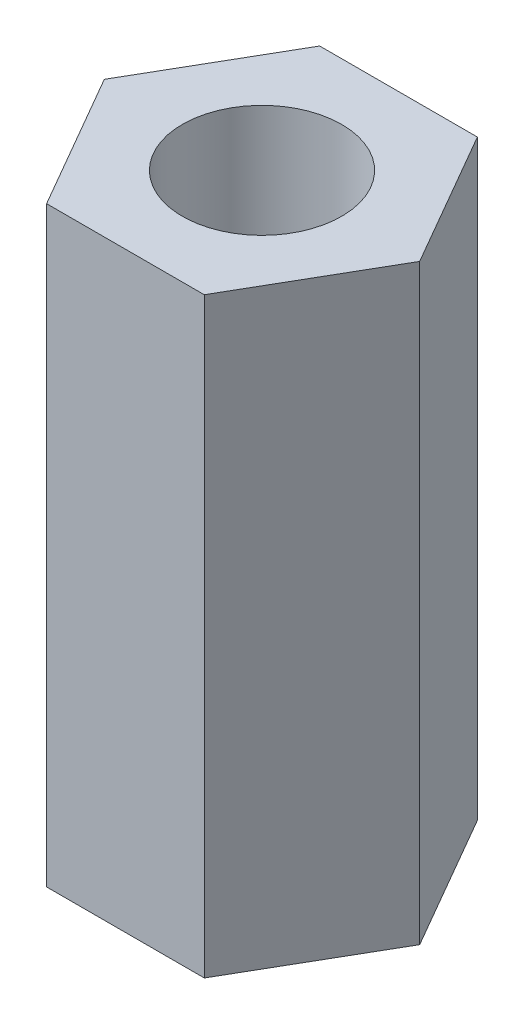
ISO-10303-21;
HEADER;
FILE_DESCRIPTION(('STEP AP214'),'2;1');
FILE_NAME('part.step','',(''),(''),'','','');
FILE_SCHEMA(('AUTOMOTIVE_DESIGN { 1 0 10303 214 1 1 1 1 }'));
ENDSEC;
DATA;
#1=APPLICATION_CONTEXT('core data for automotive mechanical design processes');
#2=APPLICATION_PROTOCOL_DEFINITION('international standard','automotive_design',2000,#1);
#3=PRODUCT_CONTEXT('',#1,'mechanical');
#4=PRODUCT('Part','Part','',(#3));
#5=PRODUCT_RELATED_PRODUCT_CATEGORY('part','',(#4));
#6=PRODUCT_DEFINITION_FORMATION('','',#4);
#7=PRODUCT_DEFINITION_CONTEXT('part definition',#1,'design');
#8=PRODUCT_DEFINITION('design','',#6,#7);
#9=PRODUCT_DEFINITION_SHAPE('','',#8);
#10=(LENGTH_UNIT() NAMED_UNIT(*) SI_UNIT(.MILLI.,.METRE.));
#11=(NAMED_UNIT(*) PLANE_ANGLE_UNIT() SI_UNIT($,.RADIAN.));
#12=(NAMED_UNIT(*) SI_UNIT($,.STERADIAN.) SOLID_ANGLE_UNIT());
#13=UNCERTAINTY_MEASURE_WITH_UNIT(LENGTH_MEASURE(1.E-05),#10,'distance_accuracy_value','');
#14=(GEOMETRIC_REPRESENTATION_CONTEXT(3) GLOBAL_UNCERTAINTY_ASSIGNED_CONTEXT((#13)) GLOBAL_UNIT_ASSIGNED_CONTEXT((#10,
#11,#12)) REPRESENTATION_CONTEXT('',''));
#15=CARTESIAN_POINT('',(0.,0.,0.));
#16=DIRECTION('',(0.,0.,1.));
#17=DIRECTION('',(1.,0.,0.));
#18=AXIS2_PLACEMENT_3D('',#15,#16,#17);
#19=CARTESIAN_POINT('',(0.,13.,0.));
#20=DIRECTION('',(0.,1.,0.));
#21=DIRECTION('',(0.,0.,1.));
#22=AXIS2_PLACEMENT_3D('',#19,#20,#21);
#23=PLANE('',#22);
#24=DIRECTION('',(0.5,0.,-0.866025403784439));
#25=VECTOR('',#24,1.);
#26=CARTESIAN_POINT('',(1.73205080756888,13.,3.));
#27=LINE('',#26,#25);
#28=CARTESIAN_POINT('',(1.73205080756888,13.,3.));
#29=VERTEX_POINT('',#28);
#30=CARTESIAN_POINT('',(3.46410161513775,13.,0.));
#31=VERTEX_POINT('',#30);
#32=EDGE_CURVE('E135',#29,#31,#27,.T.);
#33=ORIENTED_EDGE('',*,*,#32,.T.);
#34=DIRECTION('',(-0.5,0.,-0.866025403784438));
#35=VECTOR('',#34,1.);
#36=CARTESIAN_POINT('',(3.46410161513775,13.,0.));
#37=LINE('',#36,#35);
#38=CARTESIAN_POINT('',(1.73205080756887,13.,-3.));
#39=VERTEX_POINT('',#38);
#40=EDGE_CURVE('E93',#31,#39,#37,.T.);
#41=ORIENTED_EDGE('',*,*,#40,.T.);
#42=DIRECTION('',(-1.,0.,0.));
#43=VECTOR('',#42,1.);
#44=CARTESIAN_POINT('',(1.73205080756887,13.,-3.));
#45=LINE('',#44,#43);
#46=CARTESIAN_POINT('',(-1.73205080756888,13.,-3.));
#47=VERTEX_POINT('',#46);
#48=EDGE_CURVE('E106',#39,#47,#45,.T.);
#49=ORIENTED_EDGE('',*,*,#48,.T.);
#50=DIRECTION('',(-0.5,0.,0.866025403784439));
#51=VECTOR('',#50,1.);
#52=CARTESIAN_POINT('',(-1.73205080756888,13.,-3.));
#53=LINE('',#52,#51);
#54=CARTESIAN_POINT('',(-3.46410161513776,13.,0.));
#55=VERTEX_POINT('',#54);
#56=EDGE_CURVE('E100',#47,#55,#53,.T.);
#57=ORIENTED_EDGE('',*,*,#56,.T.);
#58=DIRECTION('',(0.5,0.,0.866025403784439));
#59=VECTOR('',#58,1.);
#60=CARTESIAN_POINT('',(-3.46410161513776,13.,0.));
#61=LINE('',#60,#59);
#62=CARTESIAN_POINT('',(-1.73205080756888,13.,3.));
#63=VERTEX_POINT('',#62);
#64=EDGE_CURVE('E104',#55,#63,#61,.T.);
#65=ORIENTED_EDGE('',*,*,#64,.T.);
#66=DIRECTION('',(1.,0.,0.));
#67=VECTOR('',#66,1.);
#68=CARTESIAN_POINT('',(-1.73205080756888,13.,3.));
#69=LINE('',#68,#67);
#70=EDGE_CURVE('E56',#63,#29,#69,.T.);
#71=ORIENTED_EDGE('',*,*,#70,.T.);
#72=EDGE_LOOP('',(#33,#41,#49,#57,#65,#71));
#73=FACE_BOUND('',#72,.T.);
#74=CARTESIAN_POINT('',(0.,13.,0.));
#75=DIRECTION('',(0.,1.,0.));
#76=DIRECTION('',(0.,0.,1.));
#77=AXIS2_PLACEMENT_3D('',#74,#75,#76);
#78=CIRCLE('',#77,1.75);
#79=CARTESIAN_POINT('',(0.,13.,-1.75));
#80=VERTEX_POINT('',#79);
#81=EDGE_CURVE('E128',#80,#80,#78,.T.);
#82=ORIENTED_EDGE('',*,*,#81,.F.);
#83=EDGE_LOOP('',(#82));
#84=FACE_BOUND('',#83,.T.);
#85=ADVANCED_FACE('F39',(#73,#84),#23,.T.);
#86=CARTESIAN_POINT('',(0.,0.,0.));
#87=DIRECTION('',(0.,1.,0.));
#88=DIRECTION('',(0.,0.,1.));
#89=AXIS2_PLACEMENT_3D('',#86,#87,#88);
#90=PLANE('',#89);
#91=DIRECTION('',(0.5,0.,-0.866025403784439));
#92=VECTOR('',#91,1.);
#93=CARTESIAN_POINT('',(1.73205080756888,0.,3.));
#94=LINE('',#93,#92);
#95=CARTESIAN_POINT('',(1.73205080756888,0.,3.));
#96=VERTEX_POINT('',#95);
#97=CARTESIAN_POINT('',(3.46410161513775,0.,0.));
#98=VERTEX_POINT('',#97);
#99=EDGE_CURVE('E124',#96,#98,#94,.T.);
#100=ORIENTED_EDGE('',*,*,#99,.F.);
#101=DIRECTION('',(1.,0.,0.));
#102=VECTOR('',#101,1.);
#103=CARTESIAN_POINT('',(-1.73205080756888,0.,3.));
#104=LINE('',#103,#102);
#105=CARTESIAN_POINT('',(-1.73205080756888,0.,3.));
#106=VERTEX_POINT('',#105);
#107=EDGE_CURVE('E85',#106,#96,#104,.T.);
#108=ORIENTED_EDGE('',*,*,#107,.F.);
#109=DIRECTION('',(0.5,0.,0.866025403784439));
#110=VECTOR('',#109,1.);
#111=CARTESIAN_POINT('',(-3.46410161513776,0.,0.));
#112=LINE('',#111,#110);
#113=CARTESIAN_POINT('',(-3.46410161513776,0.,0.));
#114=VERTEX_POINT('',#113);
#115=EDGE_CURVE('E79',#114,#106,#112,.T.);
#116=ORIENTED_EDGE('',*,*,#115,.F.);
#117=DIRECTION('',(-0.5,0.,0.866025403784439));
#118=VECTOR('',#117,1.);
#119=CARTESIAN_POINT('',(-1.73205080756888,0.,-3.));
#120=LINE('',#119,#118);
#121=CARTESIAN_POINT('',(-1.73205080756888,0.,-3.));
#122=VERTEX_POINT('',#121);
#123=EDGE_CURVE('E114',#122,#114,#120,.T.);
#124=ORIENTED_EDGE('',*,*,#123,.F.);
#125=DIRECTION('',(-1.,0.,0.));
#126=VECTOR('',#125,1.);
#127=CARTESIAN_POINT('',(1.73205080756887,0.,-3.));
#128=LINE('',#127,#126);
#129=CARTESIAN_POINT('',(1.73205080756887,0.,-3.));
#130=VERTEX_POINT('',#129);
#131=EDGE_CURVE('E130',#130,#122,#128,.T.);
#132=ORIENTED_EDGE('',*,*,#131,.F.);
#133=DIRECTION('',(-0.5,0.,-0.866025403784438));
#134=VECTOR('',#133,1.);
#135=CARTESIAN_POINT('',(3.46410161513775,0.,0.));
#136=LINE('',#135,#134);
#137=EDGE_CURVE('E127',#98,#130,#136,.T.);
#138=ORIENTED_EDGE('',*,*,#137,.F.);
#139=EDGE_LOOP('',(#100,#108,#116,#124,#132,#138));
#140=FACE_BOUND('',#139,.T.);
#141=CARTESIAN_POINT('',(0.,0.,0.));
#142=DIRECTION('',(0.,1.,0.));
#143=DIRECTION('',(0.,0.,1.));
#144=AXIS2_PLACEMENT_3D('',#141,#142,#143);
#145=CIRCLE('',#144,1.75);
#146=CARTESIAN_POINT('',(0.,0.,-1.75));
#147=VERTEX_POINT('',#146);
#148=EDGE_CURVE('E228',#147,#147,#145,.T.);
#149=ORIENTED_EDGE('',*,*,#148,.T.);
#150=EDGE_LOOP('',(#149));
#151=FACE_BOUND('',#150,.T.);
#152=ADVANCED_FACE('F144',(#140,#151),#90,.F.);
#153=CARTESIAN_POINT('',(1.73205080756888,13.,3.));
#154=DIRECTION('',(-0.866025403784439,0.,-0.5));
#155=DIRECTION('',(-0.5,0.,0.866025403784439));
#156=AXIS2_PLACEMENT_3D('',#153,#154,#155);
#157=PLANE('',#156);
#158=ORIENTED_EDGE('',*,*,#99,.T.);
#159=DIRECTION('',(0.,-1.,0.));
#160=VECTOR('',#159,1.);
#161=CARTESIAN_POINT('',(3.46410161513775,13.,0.));
#162=LINE('',#161,#160);
#163=EDGE_CURVE('E11',#31,#98,#162,.T.);
#164=ORIENTED_EDGE('',*,*,#163,.F.);
#165=ORIENTED_EDGE('',*,*,#32,.F.);
#166=DIRECTION('',(0.,-1.,0.));
#167=VECTOR('',#166,1.);
#168=CARTESIAN_POINT('',(1.73205080756888,13.,3.));
#169=LINE('',#168,#167);
#170=EDGE_CURVE('E120',#29,#96,#169,.T.);
#171=ORIENTED_EDGE('',*,*,#170,.T.);
#172=EDGE_LOOP('',(#158,#164,#165,#171));
#173=FACE_BOUND('',#172,.T.);
#174=ADVANCED_FACE('F41',(#173),#157,.F.);
#175=CARTESIAN_POINT('',(3.46410161513775,13.,0.));
#176=DIRECTION('',(-0.866025403784438,0.,0.5));
#177=DIRECTION('',(0.5,0.,0.866025403784439));
#178=AXIS2_PLACEMENT_3D('',#175,#176,#177);
#179=PLANE('',#178);
#180=ORIENTED_EDGE('',*,*,#137,.T.);
#181=DIRECTION('',(0.,-1.,0.));
#182=VECTOR('',#181,1.);
#183=CARTESIAN_POINT('',(1.73205080756887,13.,-3.));
#184=LINE('',#183,#182);
#185=EDGE_CURVE('E48',#39,#130,#184,.T.);
#186=ORIENTED_EDGE('',*,*,#185,.F.);
#187=ORIENTED_EDGE('',*,*,#40,.F.);
#188=ORIENTED_EDGE('',*,*,#163,.T.);
#189=EDGE_LOOP('',(#180,#186,#187,#188));
#190=FACE_BOUND('',#189,.T.);
#191=ADVANCED_FACE('F169',(#190),#179,.F.);
#192=CARTESIAN_POINT('',(1.73205080756887,13.,-3.));
#193=DIRECTION('',(0.,0.,1.));
#194=DIRECTION('',(1.,0.,0.));
#195=AXIS2_PLACEMENT_3D('',#192,#193,#194);
#196=PLANE('',#195);
#197=ORIENTED_EDGE('',*,*,#131,.T.);
#198=DIRECTION('',(0.,-1.,0.));
#199=VECTOR('',#198,1.);
#200=CARTESIAN_POINT('',(-1.73205080756888,13.,-3.));
#201=LINE('',#200,#199);
#202=EDGE_CURVE('E115',#47,#122,#201,.T.);
#203=ORIENTED_EDGE('',*,*,#202,.F.);
#204=ORIENTED_EDGE('',*,*,#48,.F.);
#205=ORIENTED_EDGE('',*,*,#185,.T.);
#206=EDGE_LOOP('',(#197,#203,#204,#205));
#207=FACE_BOUND('',#206,.T.);
#208=ADVANCED_FACE('F141',(#207),#196,.F.);
#209=CARTESIAN_POINT('',(-1.73205080756888,13.,-3.));
#210=DIRECTION('',(0.866025403784439,0.,0.5));
#211=DIRECTION('',(0.5,0.,-0.866025403784439));
#212=AXIS2_PLACEMENT_3D('',#209,#210,#211);
#213=PLANE('',#212);
#214=ORIENTED_EDGE('',*,*,#123,.T.);
#215=DIRECTION('',(0.,-1.,0.));
#216=VECTOR('',#215,1.);
#217=CARTESIAN_POINT('',(-3.46410161513776,13.,0.));
#218=LINE('',#217,#216);
#219=EDGE_CURVE('E111',#55,#114,#218,.T.);
#220=ORIENTED_EDGE('',*,*,#219,.F.);
#221=ORIENTED_EDGE('',*,*,#56,.F.);
#222=ORIENTED_EDGE('',*,*,#202,.T.);
#223=EDGE_LOOP('',(#214,#220,#221,#222));
#224=FACE_BOUND('',#223,.T.);
#225=ADVANCED_FACE('F112',(#224),#213,.F.);
#226=CARTESIAN_POINT('',(-3.46410161513776,13.,0.));
#227=DIRECTION('',(0.866025403784438,0.,-0.5));
#228=DIRECTION('',(-0.5,0.,-0.866025403784439));
#229=AXIS2_PLACEMENT_3D('',#226,#227,#228);
#230=PLANE('',#229);
#231=ORIENTED_EDGE('',*,*,#115,.T.);
#232=DIRECTION('',(0.,-1.,0.));
#233=VECTOR('',#232,1.);
#234=CARTESIAN_POINT('',(-1.73205080756888,13.,3.));
#235=LINE('',#234,#233);
#236=EDGE_CURVE('E116',#63,#106,#235,.T.);
#237=ORIENTED_EDGE('',*,*,#236,.F.);
#238=ORIENTED_EDGE('',*,*,#64,.F.);
#239=ORIENTED_EDGE('',*,*,#219,.T.);
#240=EDGE_LOOP('',(#231,#237,#238,#239));
#241=FACE_BOUND('',#240,.T.);
#242=ADVANCED_FACE('F118',(#241),#230,.F.);
#243=CARTESIAN_POINT('',(-1.73205080756888,13.,3.));
#244=DIRECTION('',(0.,0.,-1.));
#245=DIRECTION('',(-1.,0.,0.));
#246=AXIS2_PLACEMENT_3D('',#243,#244,#245);
#247=PLANE('',#246);
#248=ORIENTED_EDGE('',*,*,#107,.T.);
#249=ORIENTED_EDGE('',*,*,#170,.F.);
#250=ORIENTED_EDGE('',*,*,#70,.F.);
#251=ORIENTED_EDGE('',*,*,#236,.T.);
#252=EDGE_LOOP('',(#248,#249,#250,#251));
#253=FACE_BOUND('',#252,.T.);
#254=ADVANCED_FACE('F149',(#253),#247,.F.);
#255=CARTESIAN_POINT('',(0.,13.,0.));
#256=DIRECTION('',(0.,-1.,0.));
#257=DIRECTION('',(0.,0.,-1.));
#258=AXIS2_PLACEMENT_3D('',#255,#256,#257);
#259=CYLINDRICAL_SURFACE('',#258,1.75);
#260=CARTESIAN_POINT('',(0.,13.,-1.75));
#261=CARTESIAN_POINT('',(0.,12.8645833333333,-1.75));
#262=CARTESIAN_POINT('',(0.,12.7291666666667,-1.75));
#263=CARTESIAN_POINT('',(0.,12.4583333333333,-1.75));
#264=CARTESIAN_POINT('',(0.,12.3229166666667,-1.75));
#265=CARTESIAN_POINT('',(0.,12.0520833333333,-1.75));
#266=CARTESIAN_POINT('',(0.,11.9166666666667,-1.75));
#267=CARTESIAN_POINT('',(0.,11.6458333333333,-1.75));
#268=CARTESIAN_POINT('',(0.,11.5104166666667,-1.75));
#269=CARTESIAN_POINT('',(0.,11.2395833333333,-1.75));
#270=CARTESIAN_POINT('',(0.,11.1041666666667,-1.75));
#271=CARTESIAN_POINT('',(0.,10.8333333333333,-1.75));
#272=CARTESIAN_POINT('',(0.,10.6979166666667,-1.75));
#273=CARTESIAN_POINT('',(0.,10.4270833333333,-1.75));
#274=CARTESIAN_POINT('',(0.,10.2916666666667,-1.75));
#275=CARTESIAN_POINT('',(0.,10.0208333333333,-1.75));
#276=CARTESIAN_POINT('',(0.,9.88541666666667,-1.75));
#277=CARTESIAN_POINT('',(0.,9.61458333333333,-1.75));
#278=CARTESIAN_POINT('',(0.,9.47916666666667,-1.75));
#279=CARTESIAN_POINT('',(0.,9.20833333333333,-1.75));
#280=CARTESIAN_POINT('',(0.,9.07291666666667,-1.75));
#281=CARTESIAN_POINT('',(0.,8.80208333333333,-1.75));
#282=CARTESIAN_POINT('',(0.,8.66666666666667,-1.75));
#283=CARTESIAN_POINT('',(0.,8.39583333333333,-1.75));
#284=CARTESIAN_POINT('',(0.,8.26041666666667,-1.75));
#285=CARTESIAN_POINT('',(0.,7.98958333333333,-1.75));
#286=CARTESIAN_POINT('',(0.,7.85416666666667,-1.75));
#287=CARTESIAN_POINT('',(0.,7.58333333333333,-1.75));
#288=CARTESIAN_POINT('',(0.,7.44791666666667,-1.75));
#289=CARTESIAN_POINT('',(0.,7.17708333333333,-1.75));
#290=CARTESIAN_POINT('',(0.,7.04166666666667,-1.75));
#291=CARTESIAN_POINT('',(0.,6.77083333333333,-1.75));
#292=CARTESIAN_POINT('',(0.,6.63541666666667,-1.75));
#293=CARTESIAN_POINT('',(0.,6.36458333333333,-1.75));
#294=CARTESIAN_POINT('',(0.,6.22916666666667,-1.75));
#295=CARTESIAN_POINT('',(0.,5.95833333333333,-1.75));
#296=CARTESIAN_POINT('',(0.,5.82291666666667,-1.75));
#297=CARTESIAN_POINT('',(0.,5.55208333333333,-1.75));
#298=CARTESIAN_POINT('',(0.,5.41666666666667,-1.75));
#299=CARTESIAN_POINT('',(0.,5.14583333333333,-1.75));
#300=CARTESIAN_POINT('',(0.,5.01041666666667,-1.75));
#301=CARTESIAN_POINT('',(0.,4.73958333333333,-1.75));
#302=CARTESIAN_POINT('',(0.,4.60416666666667,-1.75));
#303=CARTESIAN_POINT('',(0.,4.33333333333333,-1.75));
#304=CARTESIAN_POINT('',(0.,4.19791666666667,-1.75));
#305=CARTESIAN_POINT('',(0.,3.92708333333333,-1.75));
#306=CARTESIAN_POINT('',(0.,3.79166666666667,-1.75));
#307=CARTESIAN_POINT('',(0.,3.52083333333333,-1.75));
#308=CARTESIAN_POINT('',(0.,3.38541666666667,-1.75));
#309=CARTESIAN_POINT('',(0.,3.11458333333333,-1.75));
#310=CARTESIAN_POINT('',(0.,2.97916666666667,-1.75));
#311=CARTESIAN_POINT('',(0.,2.70833333333333,-1.75));
#312=CARTESIAN_POINT('',(0.,2.57291666666667,-1.75));
#313=CARTESIAN_POINT('',(0.,2.30208333333333,-1.75));
#314=CARTESIAN_POINT('',(0.,2.16666666666667,-1.75));
#315=CARTESIAN_POINT('',(0.,1.89583333333333,-1.75));
#316=CARTESIAN_POINT('',(0.,1.76041666666667,-1.75));
#317=CARTESIAN_POINT('',(0.,1.48958333333333,-1.75));
#318=CARTESIAN_POINT('',(0.,1.35416666666667,-1.75));
#319=CARTESIAN_POINT('',(0.,1.08333333333333,-1.75));
#320=CARTESIAN_POINT('',(0.,0.947916666666667,-1.75));
#321=CARTESIAN_POINT('',(0.,0.677083333333334,-1.75));
#322=CARTESIAN_POINT('',(0.,0.541666666666667,-1.75));
#323=CARTESIAN_POINT('',(0.,0.270833333333334,-1.75));
#324=CARTESIAN_POINT('',(0.,0.135416666666667,-1.75));
#325=CARTESIAN_POINT('',(0.,0.,-1.75));
#326=B_SPLINE_CURVE_WITH_KNOTS('',3,(#260,#261,#262,#263,#264,#265,#266,#267,#268,#269,#270,
#271,#272,#273,#274,#275,#276,#277,#278,#279,#280,#281,#282,#283,#284,#285,#286,#287,#288,#289,
#290,#291,#292,#293,#294,#295,#296,#297,#298,#299,#300,#301,#302,#303,#304,#305,#306,#307,#308,
#309,#310,#311,#312,#313,#314,#315,#316,#317,#318,#319,#320,#321,#322,#323,#324,#325),
.UNSPECIFIED.,.F.,.F.,(4,2,2,2,2,2,2,2,2,2,2,2,2,2,2,2,2,2,2,2,2,2,2,2,2,2,2,2,2,2,2,2,4),(0.,
0.406249999999999,0.812499999999999,1.21875,1.625,2.03125,2.4375,2.84375,3.25,3.65625,4.0625,
4.46875,4.875,5.28125,5.6875,6.09375,6.5,6.90625,7.3125,7.71875,8.125,8.53125,8.9375,9.34375,
9.75,10.15625,10.5625,10.96875,11.375,11.78125,12.1875,12.59375,13.),.UNSPECIFIED.);
#327=EDGE_CURVE('BSEAM151',#80,#147,#326,.T.);
#328=ORIENTED_EDGE('',*,*,#81,.T.);
#329=ORIENTED_EDGE('',*,*,#148,.F.);
#330=ORIENTED_EDGE('',*,*,#327,.T.);
#331=ORIENTED_EDGE('',*,*,#327,.F.);
#332=EDGE_LOOP('',(#328,#330,#329,#331));
#333=FACE_BOUND('',#332,.T.);
#334=ADVANCED_FACE('F151',(#333),#259,.F.);
#335=CLOSED_SHELL('',(#85,#152,#174,#191,#208,#225,#242,#254,#334));
#336=MANIFOLD_SOLID_BREP('B2',#335);
#337=ADVANCED_BREP_SHAPE_REPRESENTATION('',(#18,#336),#14);
#338=SHAPE_DEFINITION_REPRESENTATION(#9,#337);
ENDSEC;
END-ISO-10303-21;
